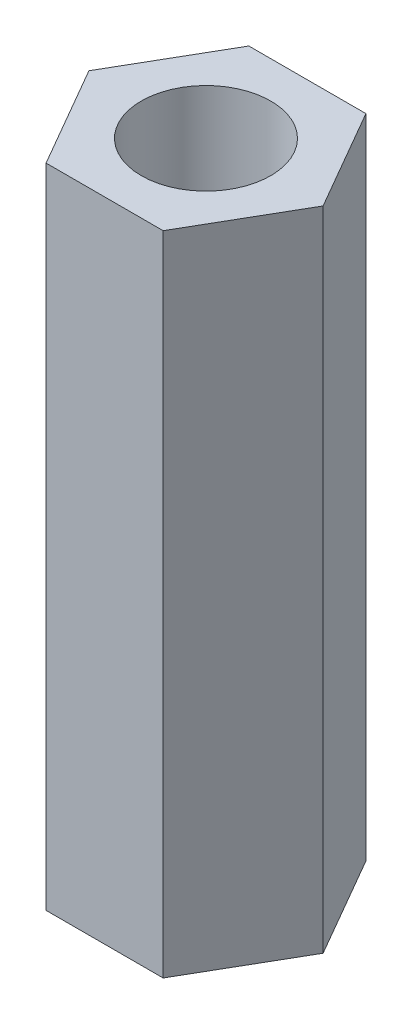
ISO-10303-21;
HEADER;
FILE_DESCRIPTION(('STEP AP214'),'2;1');
FILE_NAME('part.step','',(''),(''),'','','');
FILE_SCHEMA(('AUTOMOTIVE_DESIGN { 1 0 10303 214 1 1 1 1 }'));
ENDSEC;
DATA;
#1=APPLICATION_CONTEXT('core data for automotive mechanical design processes');
#2=APPLICATION_PROTOCOL_DEFINITION('international standard','automotive_design',2000,#1);
#3=PRODUCT_CONTEXT('',#1,'mechanical');
#4=PRODUCT('Part','Part','',(#3));
#5=PRODUCT_RELATED_PRODUCT_CATEGORY('part','',(#4));
#6=PRODUCT_DEFINITION_FORMATION('','',#4);
#7=PRODUCT_DEFINITION_CONTEXT('part definition',#1,'design');
#8=PRODUCT_DEFINITION('design','',#6,#7);
#9=PRODUCT_DEFINITION_SHAPE('','',#8);
#10=(LENGTH_UNIT() NAMED_UNIT(*) SI_UNIT(.MILLI.,.METRE.));
#11=(NAMED_UNIT(*) PLANE_ANGLE_UNIT() SI_UNIT($,.RADIAN.));
#12=(NAMED_UNIT(*) SI_UNIT($,.STERADIAN.) SOLID_ANGLE_UNIT());
#13=UNCERTAINTY_MEASURE_WITH_UNIT(LENGTH_MEASURE(1.E-05),#10,'distance_accuracy_value','');
#14=(GEOMETRIC_REPRESENTATION_CONTEXT(3) GLOBAL_UNCERTAINTY_ASSIGNED_CONTEXT((#13)) GLOBAL_UNIT_ASSIGNED_CONTEXT((#10,
#11,#12)) REPRESENTATION_CONTEXT('',''));
#15=CARTESIAN_POINT('',(0.,0.,0.));
#16=DIRECTION('',(0.,0.,1.));
#17=DIRECTION('',(1.,0.,0.));
#18=AXIS2_PLACEMENT_3D('',#15,#16,#17);
#19=CARTESIAN_POINT('',(0.,15.,0.));
#20=DIRECTION('',(0.,1.,0.));
#21=DIRECTION('',(0.,0.,1.));
#22=AXIS2_PLACEMENT_3D('',#19,#20,#21);
#23=PLANE('',#22);
#24=DIRECTION('',(0.499999999999995,0.,-0.866025403784441));
#25=VECTOR('',#24,1.);
#26=CARTESIAN_POINT('',(1.35677313259565,15.,2.34999999999999));
#27=LINE('',#26,#25);
#28=CARTESIAN_POINT('',(1.35677313259565,15.,2.34999999999999));
#29=VERTEX_POINT('',#28);
#30=CARTESIAN_POINT('',(2.71354626519124,15.,0.));
#31=VERTEX_POINT('',#30);
#32=EDGE_CURVE('E150',#29,#31,#27,.T.);
#33=ORIENTED_EDGE('',*,*,#32,.T.);
#34=DIRECTION('',(-0.500000000000001,0.,-0.866025403784438));
#35=VECTOR('',#34,1.);
#36=CARTESIAN_POINT('',(2.71354626519124,15.,0.));
#37=LINE('',#36,#35);
#38=CARTESIAN_POINT('',(1.35677313259562,15.,-2.35));
#39=VERTEX_POINT('',#38);
#40=EDGE_CURVE('E98',#31,#39,#37,.T.);
#41=ORIENTED_EDGE('',*,*,#40,.T.);
#42=DIRECTION('',(-1.,0.,0.));
#43=VECTOR('',#42,1.);
#44=CARTESIAN_POINT('',(1.35677313259562,15.,-2.35));
#45=LINE('',#44,#43);
#46=CARTESIAN_POINT('',(-1.35677313259563,15.,-2.35));
#47=VERTEX_POINT('',#46);
#48=EDGE_CURVE('E111',#39,#47,#45,.T.);
#49=ORIENTED_EDGE('',*,*,#48,.T.);
#50=DIRECTION('',(-0.499999999999995,0.,0.866025403784441));
#51=VECTOR('',#50,1.);
#52=CARTESIAN_POINT('',(-1.35677313259563,15.,-2.35));
#53=LINE('',#52,#51);
#54=CARTESIAN_POINT('',(-2.71354626519124,15.,0.));
#55=VERTEX_POINT('',#54);
#56=EDGE_CURVE('E105',#47,#55,#53,.T.);
#57=ORIENTED_EDGE('',*,*,#56,.T.);
#58=DIRECTION('',(0.500000000000007,0.,0.866025403784435));
#59=VECTOR('',#58,1.);
#60=CARTESIAN_POINT('',(-2.71354626519124,15.,0.));
#61=LINE('',#60,#59);
#62=CARTESIAN_POINT('',(-1.3567731325956,15.,2.35000000000001));
#63=VERTEX_POINT('',#62);
#64=EDGE_CURVE('E109',#55,#63,#61,.T.);
#65=ORIENTED_EDGE('',*,*,#64,.T.);
#66=DIRECTION('',(1.,0.,0.));
#67=VECTOR('',#66,1.);
#68=CARTESIAN_POINT('',(-1.3567731325956,15.,2.35000000000001));
#69=LINE('',#68,#67);
#70=EDGE_CURVE('E61',#63,#29,#69,.T.);
#71=ORIENTED_EDGE('',*,*,#70,.T.);
#72=EDGE_LOOP('',(#33,#41,#49,#57,#65,#71));
#73=FACE_BOUND('',#72,.T.);
#74=CARTESIAN_POINT('',(0.,15.,0.));
#75=DIRECTION('',(0.,1.,0.));
#76=DIRECTION('',(0.,0.,1.));
#77=AXIS2_PLACEMENT_3D('',#74,#75,#76);
#78=CIRCLE('',#77,1.5);
#79=CARTESIAN_POINT('',(0.,15.,1.5));
#80=VERTEX_POINT('',#79);
#81=EDGE_CURVE('E138',#80,#80,#78,.T.);
#82=ORIENTED_EDGE('',*,*,#81,.F.);
#83=EDGE_LOOP('',(#82));
#84=FACE_BOUND('',#83,.T.);
#85=ADVANCED_FACE('F43',(#73,#84),#23,.T.);
#86=CARTESIAN_POINT('',(0.,0.,0.));
#87=DIRECTION('',(0.,1.,0.));
#88=DIRECTION('',(0.,0.,1.));
#89=AXIS2_PLACEMENT_3D('',#86,#87,#88);
#90=PLANE('',#89);
#91=DIRECTION('',(0.499999999999995,0.,-0.866025403784441));
#92=VECTOR('',#91,1.);
#93=CARTESIAN_POINT('',(1.35677313259565,0.,2.34999999999999));
#94=LINE('',#93,#92);
#95=CARTESIAN_POINT('',(1.35677313259565,0.,2.34999999999999));
#96=VERTEX_POINT('',#95);
#97=CARTESIAN_POINT('',(2.71354626519124,0.,0.));
#98=VERTEX_POINT('',#97);
#99=EDGE_CURVE('E133',#96,#98,#94,.T.);
#100=ORIENTED_EDGE('',*,*,#99,.F.);
#101=DIRECTION('',(1.,0.,0.));
#102=VECTOR('',#101,1.);
#103=CARTESIAN_POINT('',(-1.3567731325956,0.,2.35000000000001));
#104=LINE('',#103,#102);
#105=CARTESIAN_POINT('',(-1.3567731325956,0.,2.35000000000001));
#106=VERTEX_POINT('',#105);
#107=EDGE_CURVE('E90',#106,#96,#104,.T.);
#108=ORIENTED_EDGE('',*,*,#107,.F.);
#109=DIRECTION('',(0.500000000000007,0.,0.866025403784435));
#110=VECTOR('',#109,1.);
#111=CARTESIAN_POINT('',(-2.71354626519124,0.,0.));
#112=LINE('',#111,#110);
#113=CARTESIAN_POINT('',(-2.71354626519124,0.,0.));
#114=VERTEX_POINT('',#113);
#115=EDGE_CURVE('E84',#114,#106,#112,.T.);
#116=ORIENTED_EDGE('',*,*,#115,.F.);
#117=DIRECTION('',(-0.499999999999995,0.,0.866025403784441));
#118=VECTOR('',#117,1.);
#119=CARTESIAN_POINT('',(-1.35677313259563,0.,-2.35));
#120=LINE('',#119,#118);
#121=CARTESIAN_POINT('',(-1.35677313259563,0.,-2.35));
#122=VERTEX_POINT('',#121);
#123=EDGE_CURVE('E120',#122,#114,#120,.T.);
#124=ORIENTED_EDGE('',*,*,#123,.F.);
#125=DIRECTION('',(-1.,0.,0.));
#126=VECTOR('',#125,1.);
#127=CARTESIAN_POINT('',(1.35677313259562,0.,-2.35));
#128=LINE('',#127,#126);
#129=CARTESIAN_POINT('',(1.35677313259562,0.,-2.35));
#130=VERTEX_POINT('',#129);
#131=EDGE_CURVE('E141',#130,#122,#128,.T.);
#132=ORIENTED_EDGE('',*,*,#131,.F.);
#133=DIRECTION('',(-0.500000000000001,0.,-0.866025403784438));
#134=VECTOR('',#133,1.);
#135=CARTESIAN_POINT('',(2.71354626519124,0.,0.));
#136=LINE('',#135,#134);
#137=EDGE_CURVE('E137',#98,#130,#136,.T.);
#138=ORIENTED_EDGE('',*,*,#137,.F.);
#139=EDGE_LOOP('',(#100,#108,#116,#124,#132,#138));
#140=FACE_BOUND('',#139,.T.);
#141=CARTESIAN_POINT('',(0.,0.,0.));
#142=DIRECTION('',(0.,1.,0.));
#143=DIRECTION('',(0.,0.,1.));
#144=AXIS2_PLACEMENT_3D('',#141,#142,#143);
#145=CIRCLE('',#144,1.5);
#146=CARTESIAN_POINT('',(0.,0.,1.5));
#147=VERTEX_POINT('',#146);
#148=EDGE_CURVE('E265',#147,#147,#145,.T.);
#149=ORIENTED_EDGE('',*,*,#148,.T.);
#150=EDGE_LOOP('',(#149));
#151=FACE_BOUND('',#150,.T.);
#152=ADVANCED_FACE('F163',(#140,#151),#90,.F.);
#153=CARTESIAN_POINT('',(1.35677313259565,15.,2.34999999999999));
#154=DIRECTION('',(-0.866025403784441,0.,-0.499999999999995));
#155=DIRECTION('',(-0.499999999999995,0.,0.866025403784442));
#156=AXIS2_PLACEMENT_3D('',#153,#154,#155);
#157=PLANE('',#156);
#158=ORIENTED_EDGE('',*,*,#99,.T.);
#159=DIRECTION('',(0.,-1.,0.));
#160=VECTOR('',#159,1.);
#161=CARTESIAN_POINT('',(2.71354626519124,15.,0.));
#162=LINE('',#161,#160);
#163=EDGE_CURVE('E11',#31,#98,#162,.T.);
#164=ORIENTED_EDGE('',*,*,#163,.F.);
#165=ORIENTED_EDGE('',*,*,#32,.F.);
#166=DIRECTION('',(0.,-1.,0.));
#167=VECTOR('',#166,1.);
#168=CARTESIAN_POINT('',(1.35677313259565,15.,2.34999999999999));
#169=LINE('',#168,#167);
#170=EDGE_CURVE('E129',#29,#96,#169,.T.);
#171=ORIENTED_EDGE('',*,*,#170,.T.);
#172=EDGE_LOOP('',(#158,#164,#165,#171));
#173=FACE_BOUND('',#172,.T.);
#174=ADVANCED_FACE('F45',(#173),#157,.F.);
#175=CARTESIAN_POINT('',(2.71354626519124,15.,0.));
#176=DIRECTION('',(-0.866025403784438,0.,0.500000000000001));
#177=DIRECTION('',(0.500000000000001,0.,0.866025403784438));
#178=AXIS2_PLACEMENT_3D('',#175,#176,#177);
#179=PLANE('',#178);
#180=ORIENTED_EDGE('',*,*,#137,.T.);
#181=DIRECTION('',(0.,-1.,0.));
#182=VECTOR('',#181,1.);
#183=CARTESIAN_POINT('',(1.35677313259562,15.,-2.35));
#184=LINE('',#183,#182);
#185=EDGE_CURVE('E53',#39,#130,#184,.T.);
#186=ORIENTED_EDGE('',*,*,#185,.F.);
#187=ORIENTED_EDGE('',*,*,#40,.F.);
#188=ORIENTED_EDGE('',*,*,#163,.T.);
#189=EDGE_LOOP('',(#180,#186,#187,#188));
#190=FACE_BOUND('',#189,.T.);
#191=ADVANCED_FACE('F188',(#190),#179,.F.);
#192=CARTESIAN_POINT('',(1.35677313259562,15.,-2.35));
#193=DIRECTION('',(0.,0.,1.));
#194=DIRECTION('',(1.,0.,0.));
#195=AXIS2_PLACEMENT_3D('',#192,#193,#194);
#196=PLANE('',#195);
#197=ORIENTED_EDGE('',*,*,#131,.T.);
#198=DIRECTION('',(0.,-1.,0.));
#199=VECTOR('',#198,1.);
#200=CARTESIAN_POINT('',(-1.35677313259563,15.,-2.35));
#201=LINE('',#200,#199);
#202=EDGE_CURVE('E122',#47,#122,#201,.T.);
#203=ORIENTED_EDGE('',*,*,#202,.F.);
#204=ORIENTED_EDGE('',*,*,#48,.F.);
#205=ORIENTED_EDGE('',*,*,#185,.T.);
#206=EDGE_LOOP('',(#197,#203,#204,#205));
#207=FACE_BOUND('',#206,.T.);
#208=ADVANCED_FACE('F160',(#207),#196,.F.);
#209=CARTESIAN_POINT('',(-1.35677313259563,15.,-2.35));
#210=DIRECTION('',(0.866025403784441,0.,0.499999999999995));
#211=DIRECTION('',(0.499999999999995,0.,-0.866025403784442));
#212=AXIS2_PLACEMENT_3D('',#209,#210,#211);
#213=PLANE('',#212);
#214=ORIENTED_EDGE('',*,*,#123,.T.);
#215=DIRECTION('',(0.,-1.,0.));
#216=VECTOR('',#215,1.);
#217=CARTESIAN_POINT('',(-2.71354626519124,15.,0.));
#218=LINE('',#217,#216);
#219=EDGE_CURVE('E117',#55,#114,#218,.T.);
#220=ORIENTED_EDGE('',*,*,#219,.F.);
#221=ORIENTED_EDGE('',*,*,#56,.F.);
#222=ORIENTED_EDGE('',*,*,#202,.T.);
#223=EDGE_LOOP('',(#214,#220,#221,#222));
#224=FACE_BOUND('',#223,.T.);
#225=ADVANCED_FACE('F118',(#224),#213,.F.);
#226=CARTESIAN_POINT('',(-2.71354626519124,15.,0.));
#227=DIRECTION('',(0.866025403784434,0.,-0.500000000000007));
#228=DIRECTION('',(-0.500000000000007,0.,-0.866025403784435));
#229=AXIS2_PLACEMENT_3D('',#226,#227,#228);
#230=PLANE('',#229);
#231=ORIENTED_EDGE('',*,*,#115,.T.);
#232=DIRECTION('',(0.,-1.,0.));
#233=VECTOR('',#232,1.);
#234=CARTESIAN_POINT('',(-1.3567731325956,15.,2.35000000000001));
#235=LINE('',#234,#233);
#236=EDGE_CURVE('E123',#63,#106,#235,.T.);
#237=ORIENTED_EDGE('',*,*,#236,.F.);
#238=ORIENTED_EDGE('',*,*,#64,.F.);
#239=ORIENTED_EDGE('',*,*,#219,.T.);
#240=EDGE_LOOP('',(#231,#237,#238,#239));
#241=FACE_BOUND('',#240,.T.);
#242=ADVANCED_FACE('F125',(#241),#230,.F.);
#243=CARTESIAN_POINT('',(-1.3567731325956,15.,2.35000000000001));
#244=DIRECTION('',(0.,0.,-1.));
#245=DIRECTION('',(-1.,0.,0.));
#246=AXIS2_PLACEMENT_3D('',#243,#244,#245);
#247=PLANE('',#246);
#248=ORIENTED_EDGE('',*,*,#107,.T.);
#249=ORIENTED_EDGE('',*,*,#170,.F.);
#250=ORIENTED_EDGE('',*,*,#70,.F.);
#251=ORIENTED_EDGE('',*,*,#236,.T.);
#252=EDGE_LOOP('',(#248,#249,#250,#251));
#253=FACE_BOUND('',#252,.T.);
#254=ADVANCED_FACE('F168',(#253),#247,.F.);
#255=CARTESIAN_POINT('',(0.,15.,0.));
#256=DIRECTION('',(0.,-1.,0.));
#257=DIRECTION('',(0.,0.,-1.));
#258=AXIS2_PLACEMENT_3D('',#255,#256,#257);
#259=CYLINDRICAL_SURFACE('',#258,1.5);
#260=ORIENTED_EDGE('',*,*,#81,.T.);
#261=EDGE_LOOP('',(#260));
#262=FACE_BOUND('',#261,.T.);
#263=ORIENTED_EDGE('',*,*,#148,.F.);
#264=EDGE_LOOP('',(#263));
#265=FACE_BOUND('',#264,.T.);
#266=ADVANCED_FACE('F170',(#262,#265),#259,.F.);
#267=CLOSED_SHELL('',(#85,#152,#174,#191,#208,#225,#242,#254,#266));
#268=MANIFOLD_SOLID_BREP('B2',#267);
#269=ADVANCED_BREP_SHAPE_REPRESENTATION('',(#18,#268),#14);
#270=SHAPE_DEFINITION_REPRESENTATION(#9,#269);
ENDSEC;
END-ISO-10303-21;
